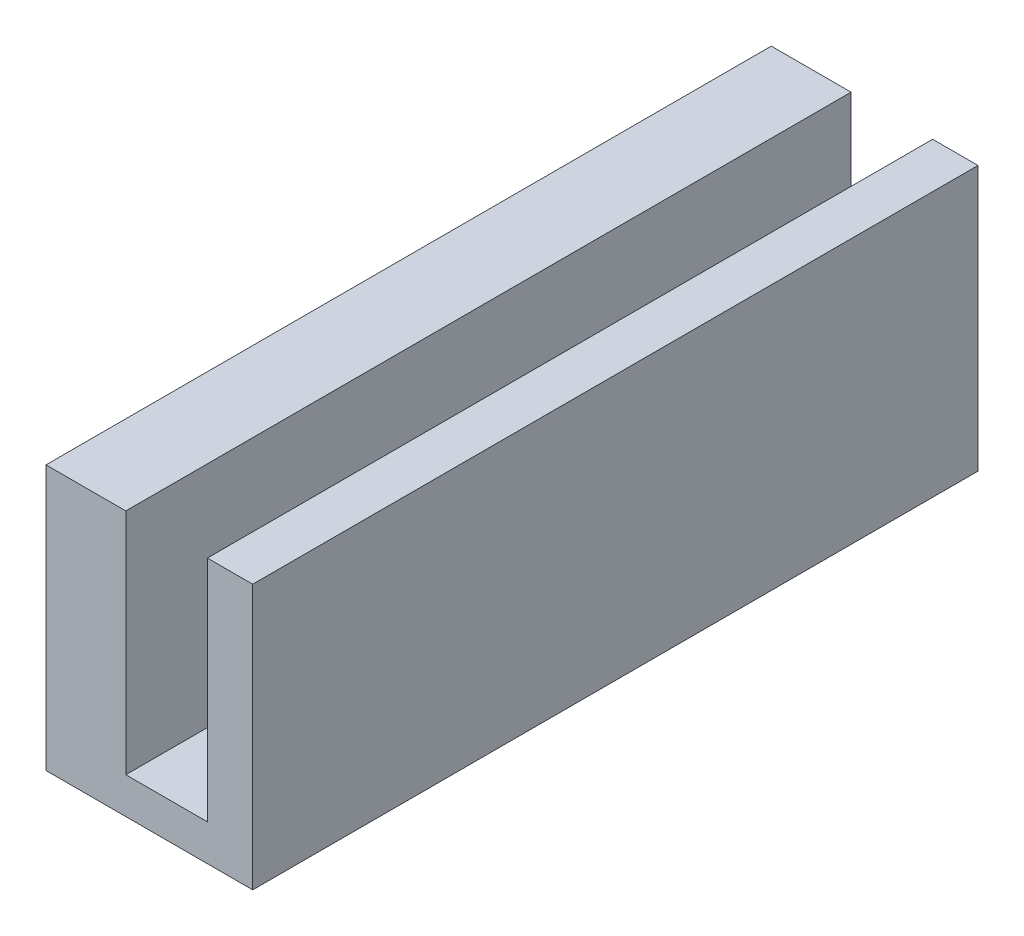
ISO-10303-21;
HEADER;
FILE_DESCRIPTION(('STEP AP214'),'2;1');
FILE_NAME('part.step','',(''),(''),'','','');
FILE_SCHEMA(('AUTOMOTIVE_DESIGN { 1 0 10303 214 1 1 1 1 }'));
ENDSEC;
DATA;
#1=APPLICATION_CONTEXT('core data for automotive mechanical design processes');
#2=APPLICATION_PROTOCOL_DEFINITION('international standard','automotive_design',2000,#1);
#3=PRODUCT_CONTEXT('',#1,'mechanical');
#4=PRODUCT('Part','Part','',(#3));
#5=PRODUCT_RELATED_PRODUCT_CATEGORY('part','',(#4));
#6=PRODUCT_DEFINITION_FORMATION('','',#4);
#7=PRODUCT_DEFINITION_CONTEXT('part definition',#1,'design');
#8=PRODUCT_DEFINITION('design','',#6,#7);
#9=PRODUCT_DEFINITION_SHAPE('','',#8);
#10=(LENGTH_UNIT() NAMED_UNIT(*) SI_UNIT(.MILLI.,.METRE.));
#11=(NAMED_UNIT(*) PLANE_ANGLE_UNIT() SI_UNIT($,.RADIAN.));
#12=(NAMED_UNIT(*) SI_UNIT($,.STERADIAN.) SOLID_ANGLE_UNIT());
#13=UNCERTAINTY_MEASURE_WITH_UNIT(LENGTH_MEASURE(1.E-05),#10,'distance_accuracy_value','');
#14=(GEOMETRIC_REPRESENTATION_CONTEXT(3) GLOBAL_UNCERTAINTY_ASSIGNED_CONTEXT((#13)) GLOBAL_UNIT_ASSIGNED_CONTEXT((#10,
#11,#12)) REPRESENTATION_CONTEXT('',''));
#15=CARTESIAN_POINT('',(0.,0.,0.));
#16=DIRECTION('',(0.,0.,1.));
#17=DIRECTION('',(1.,0.,0.));
#18=AXIS2_PLACEMENT_3D('',#15,#16,#17);
#19=CARTESIAN_POINT('',(0.,1.,0.));
#20=DIRECTION('',(0.,-1.,0.));
#21=DIRECTION('',(0.,0.,-1.));
#22=AXIS2_PLACEMENT_3D('',#19,#20,#21);
#23=PLANE('',#22);
#24=DIRECTION('',(0.,0.,1.));
#25=VECTOR('',#24,1.);
#26=CARTESIAN_POINT('',(4.45,1.,-20.));
#27=LINE('',#26,#25);
#28=CARTESIAN_POINT('',(4.45,1.,-20.));
#29=VERTEX_POINT('',#28);
#30=CARTESIAN_POINT('',(4.45,1.,0.));
#31=VERTEX_POINT('',#30);
#32=EDGE_CURVE('E125',#29,#31,#27,.T.);
#33=ORIENTED_EDGE('',*,*,#32,.F.);
#34=DIRECTION('',(-1.,0.,0.));
#35=VECTOR('',#34,1.);
#36=CARTESIAN_POINT('',(0.,1.,-20.));
#37=LINE('',#36,#35);
#38=CARTESIAN_POINT('',(2.2,1.,-20.));
#39=VERTEX_POINT('',#38);
#40=EDGE_CURVE('E37',#29,#39,#37,.T.);
#41=ORIENTED_EDGE('',*,*,#40,.T.);
#42=DIRECTION('',(0.,0.,-1.));
#43=VECTOR('',#42,1.);
#44=CARTESIAN_POINT('',(2.2,1.,-20.));
#45=LINE('',#44,#43);
#46=CARTESIAN_POINT('',(2.2,1.,0.));
#47=VERTEX_POINT('',#46);
#48=EDGE_CURVE('E56',#47,#39,#45,.T.);
#49=ORIENTED_EDGE('',*,*,#48,.F.);
#50=DIRECTION('',(1.,0.,0.));
#51=VECTOR('',#50,1.);
#52=CARTESIAN_POINT('',(0.,1.,0.));
#53=LINE('',#52,#51);
#54=EDGE_CURVE('E51',#47,#31,#53,.T.);
#55=ORIENTED_EDGE('',*,*,#54,.T.);
#56=EDGE_LOOP('',(#33,#41,#49,#55));
#57=FACE_BOUND('',#56,.T.);
#58=ADVANCED_FACE('F33',(#57),#23,.F.);
#59=CARTESIAN_POINT('',(0.,1.,0.));
#60=DIRECTION('',(1.,0.,0.));
#61=DIRECTION('',(0.,0.,-1.));
#62=AXIS2_PLACEMENT_3D('',#59,#60,#61);
#63=PLANE('',#62);
#64=DIRECTION('',(0.,0.,1.));
#65=VECTOR('',#64,1.);
#66=CARTESIAN_POINT('',(0.,0.,0.));
#67=LINE('',#66,#65);
#68=CARTESIAN_POINT('',(0.,0.,-20.));
#69=VERTEX_POINT('',#68);
#70=CARTESIAN_POINT('',(0.,0.,0.));
#71=VERTEX_POINT('',#70);
#72=EDGE_CURVE('E158',#69,#71,#67,.T.);
#73=ORIENTED_EDGE('',*,*,#72,.T.);
#74=DIRECTION('',(0.,-1.,0.));
#75=VECTOR('',#74,1.);
#76=CARTESIAN_POINT('',(0.,1.,0.));
#77=LINE('',#76,#75);
#78=CARTESIAN_POINT('',(0.,7.3,0.));
#79=VERTEX_POINT('',#78);
#80=EDGE_CURVE('E11',#79,#71,#77,.T.);
#81=ORIENTED_EDGE('',*,*,#80,.F.);
#82=DIRECTION('',(0.,0.,1.));
#83=VECTOR('',#82,1.);
#84=CARTESIAN_POINT('',(0.,7.3,-20.));
#85=LINE('',#84,#83);
#86=CARTESIAN_POINT('',(0.,7.3,-20.));
#87=VERTEX_POINT('',#86);
#88=EDGE_CURVE('E135',#87,#79,#85,.T.);
#89=ORIENTED_EDGE('',*,*,#88,.F.);
#90=DIRECTION('',(0.,-1.,0.));
#91=VECTOR('',#90,1.);
#92=CARTESIAN_POINT('',(0.,1.,-20.));
#93=LINE('',#92,#91);
#94=EDGE_CURVE('E110',#87,#69,#93,.T.);
#95=ORIENTED_EDGE('',*,*,#94,.T.);
#96=EDGE_LOOP('',(#73,#81,#89,#95));
#97=FACE_BOUND('',#96,.T.);
#98=ADVANCED_FACE('F35',(#97),#63,.F.);
#99=CARTESIAN_POINT('',(0.,1.,0.));
#100=DIRECTION('',(0.,0.,-1.));
#101=DIRECTION('',(-1.,0.,0.));
#102=AXIS2_PLACEMENT_3D('',#99,#100,#101);
#103=PLANE('',#102);
#104=DIRECTION('',(1.,0.,0.));
#105=VECTOR('',#104,1.);
#106=CARTESIAN_POINT('',(0.,0.,0.));
#107=LINE('',#106,#105);
#108=CARTESIAN_POINT('',(5.7,0.,0.));
#109=VERTEX_POINT('',#108);
#110=EDGE_CURVE('E164',#71,#109,#107,.T.);
#111=ORIENTED_EDGE('',*,*,#110,.T.);
#112=DIRECTION('',(0.,-1.,0.));
#113=VECTOR('',#112,1.);
#114=CARTESIAN_POINT('',(5.7,1.,0.));
#115=LINE('',#114,#113);
#116=CARTESIAN_POINT('',(5.7,7.3,0.));
#117=VERTEX_POINT('',#116);
#118=EDGE_CURVE('E43',#117,#109,#115,.T.);
#119=ORIENTED_EDGE('',*,*,#118,.F.);
#120=DIRECTION('',(1.,0.,0.));
#121=VECTOR('',#120,1.);
#122=CARTESIAN_POINT('',(5.7,7.3,0.));
#123=LINE('',#122,#121);
#124=CARTESIAN_POINT('',(4.45,7.3,0.));
#125=VERTEX_POINT('',#124);
#126=EDGE_CURVE('E124',#125,#117,#123,.T.);
#127=ORIENTED_EDGE('',*,*,#126,.F.);
#128=DIRECTION('',(0.,-1.,0.));
#129=VECTOR('',#128,1.);
#130=CARTESIAN_POINT('',(4.45,7.3,0.));
#131=LINE('',#130,#129);
#132=EDGE_CURVE('E130',#125,#31,#131,.T.);
#133=ORIENTED_EDGE('',*,*,#132,.T.);
#134=ORIENTED_EDGE('',*,*,#54,.F.);
#135=DIRECTION('',(0.,-1.,0.));
#136=VECTOR('',#135,1.);
#137=CARTESIAN_POINT('',(2.2,7.3,0.));
#138=LINE('',#137,#136);
#139=CARTESIAN_POINT('',(2.2,7.3,0.));
#140=VERTEX_POINT('',#139);
#141=EDGE_CURVE('E154',#140,#47,#138,.T.);
#142=ORIENTED_EDGE('',*,*,#141,.F.);
#143=DIRECTION('',(1.,0.,0.));
#144=VECTOR('',#143,1.);
#145=CARTESIAN_POINT('',(0.,7.3,0.));
#146=LINE('',#145,#144);
#147=EDGE_CURVE('E138',#79,#140,#146,.T.);
#148=ORIENTED_EDGE('',*,*,#147,.F.);
#149=ORIENTED_EDGE('',*,*,#80,.T.);
#150=EDGE_LOOP('',(#111,#119,#127,#133,#134,#142,#148,#149));
#151=FACE_BOUND('',#150,.T.);
#152=ADVANCED_FACE('F200',(#151),#103,.F.);
#153=CARTESIAN_POINT('',(5.7,1.,0.));
#154=DIRECTION('',(-1.,0.,0.));
#155=DIRECTION('',(0.,0.,1.));
#156=AXIS2_PLACEMENT_3D('',#153,#154,#155);
#157=PLANE('',#156);
#158=DIRECTION('',(0.,0.,-1.));
#159=VECTOR('',#158,1.);
#160=CARTESIAN_POINT('',(5.7,0.,0.));
#161=LINE('',#160,#159);
#162=CARTESIAN_POINT('',(5.7,0.,-20.));
#163=VERTEX_POINT('',#162);
#164=EDGE_CURVE('E107',#109,#163,#161,.T.);
#165=ORIENTED_EDGE('',*,*,#164,.T.);
#166=DIRECTION('',(0.,-1.,0.));
#167=VECTOR('',#166,1.);
#168=CARTESIAN_POINT('',(5.7,1.,-20.));
#169=LINE('',#168,#167);
#170=CARTESIAN_POINT('',(5.7,7.3,-20.));
#171=VERTEX_POINT('',#170);
#172=EDGE_CURVE('E100',#171,#163,#169,.T.);
#173=ORIENTED_EDGE('',*,*,#172,.F.);
#174=DIRECTION('',(0.,0.,-1.));
#175=VECTOR('',#174,1.);
#176=CARTESIAN_POINT('',(5.7,7.3,-20.));
#177=LINE('',#176,#175);
#178=EDGE_CURVE('E105',#117,#171,#177,.T.);
#179=ORIENTED_EDGE('',*,*,#178,.F.);
#180=ORIENTED_EDGE('',*,*,#118,.T.);
#181=EDGE_LOOP('',(#165,#173,#179,#180));
#182=FACE_BOUND('',#181,.T.);
#183=ADVANCED_FACE('F102',(#182),#157,.F.);
#184=CARTESIAN_POINT('',(0.,1.,-20.));
#185=DIRECTION('',(0.,0.,1.));
#186=DIRECTION('',(1.,0.,0.));
#187=AXIS2_PLACEMENT_3D('',#184,#185,#186);
#188=PLANE('',#187);
#189=DIRECTION('',(-1.,0.,0.));
#190=VECTOR('',#189,1.);
#191=CARTESIAN_POINT('',(0.,0.,-20.));
#192=LINE('',#191,#190);
#193=EDGE_CURVE('E173',#163,#69,#192,.T.);
#194=ORIENTED_EDGE('',*,*,#193,.T.);
#195=ORIENTED_EDGE('',*,*,#94,.F.);
#196=DIRECTION('',(-1.,0.,0.));
#197=VECTOR('',#196,1.);
#198=CARTESIAN_POINT('',(0.,7.3,-20.));
#199=LINE('',#198,#197);
#200=CARTESIAN_POINT('',(2.2,7.3,-20.));
#201=VERTEX_POINT('',#200);
#202=EDGE_CURVE('E142',#201,#87,#199,.T.);
#203=ORIENTED_EDGE('',*,*,#202,.F.);
#204=DIRECTION('',(0.,-1.,0.));
#205=VECTOR('',#204,1.);
#206=CARTESIAN_POINT('',(2.2,7.3,-20.));
#207=LINE('',#206,#205);
#208=EDGE_CURVE('E145',#201,#39,#207,.T.);
#209=ORIENTED_EDGE('',*,*,#208,.T.);
#210=ORIENTED_EDGE('',*,*,#40,.F.);
#211=DIRECTION('',(0.,-1.,0.));
#212=VECTOR('',#211,1.);
#213=CARTESIAN_POINT('',(4.45,7.3,-20.));
#214=LINE('',#213,#212);
#215=CARTESIAN_POINT('',(4.45,7.3,-20.));
#216=VERTEX_POINT('',#215);
#217=EDGE_CURVE('E116',#216,#29,#214,.T.);
#218=ORIENTED_EDGE('',*,*,#217,.F.);
#219=DIRECTION('',(-1.,0.,0.));
#220=VECTOR('',#219,1.);
#221=CARTESIAN_POINT('',(5.7,7.3,-20.));
#222=LINE('',#221,#220);
#223=EDGE_CURVE('E113',#171,#216,#222,.T.);
#224=ORIENTED_EDGE('',*,*,#223,.F.);
#225=ORIENTED_EDGE('',*,*,#172,.T.);
#226=EDGE_LOOP('',(#194,#195,#203,#209,#210,#218,#224,#225));
#227=FACE_BOUND('',#226,.T.);
#228=ADVANCED_FACE('F114',(#227),#188,.F.);
#229=CARTESIAN_POINT('',(0.,0.,0.));
#230=DIRECTION('',(0.,-1.,0.));
#231=DIRECTION('',(0.,0.,-1.));
#232=AXIS2_PLACEMENT_3D('',#229,#230,#231);
#233=PLANE('',#232);
#234=ORIENTED_EDGE('',*,*,#72,.F.);
#235=ORIENTED_EDGE('',*,*,#193,.F.);
#236=ORIENTED_EDGE('',*,*,#164,.F.);
#237=ORIENTED_EDGE('',*,*,#110,.F.);
#238=EDGE_LOOP('',(#234,#235,#236,#237));
#239=FACE_BOUND('',#238,.T.);
#240=ADVANCED_FACE('F178',(#239),#233,.T.);
#241=CARTESIAN_POINT('',(2.2,7.3,-20.));
#242=DIRECTION('',(-1.,0.,0.));
#243=DIRECTION('',(0.,0.,1.));
#244=AXIS2_PLACEMENT_3D('',#241,#242,#243);
#245=PLANE('',#244);
#246=ORIENTED_EDGE('',*,*,#48,.T.);
#247=ORIENTED_EDGE('',*,*,#208,.F.);
#248=DIRECTION('',(0.,0.,-1.));
#249=VECTOR('',#248,1.);
#250=CARTESIAN_POINT('',(2.2,7.3,-20.));
#251=LINE('',#250,#249);
#252=EDGE_CURVE('E140',#140,#201,#251,.T.);
#253=ORIENTED_EDGE('',*,*,#252,.F.);
#254=ORIENTED_EDGE('',*,*,#141,.T.);
#255=EDGE_LOOP('',(#246,#247,#253,#254));
#256=FACE_BOUND('',#255,.T.);
#257=ADVANCED_FACE('F185',(#256),#245,.F.);
#258=CARTESIAN_POINT('',(0.,7.3,0.));
#259=DIRECTION('',(0.,1.,0.));
#260=DIRECTION('',(0.,0.,1.));
#261=AXIS2_PLACEMENT_3D('',#258,#259,#260);
#262=PLANE('',#261);
#263=ORIENTED_EDGE('',*,*,#88,.T.);
#264=ORIENTED_EDGE('',*,*,#147,.T.);
#265=ORIENTED_EDGE('',*,*,#252,.T.);
#266=ORIENTED_EDGE('',*,*,#202,.T.);
#267=EDGE_LOOP('',(#263,#264,#265,#266));
#268=FACE_BOUND('',#267,.T.);
#269=ADVANCED_FACE('F183',(#268),#262,.T.);
#270=CARTESIAN_POINT('',(4.45,7.3,-20.));
#271=DIRECTION('',(1.,0.,0.));
#272=DIRECTION('',(0.,0.,-1.));
#273=AXIS2_PLACEMENT_3D('',#270,#271,#272);
#274=PLANE('',#273);
#275=ORIENTED_EDGE('',*,*,#32,.T.);
#276=ORIENTED_EDGE('',*,*,#132,.F.);
#277=DIRECTION('',(0.,0.,1.));
#278=VECTOR('',#277,1.);
#279=CARTESIAN_POINT('',(4.45,7.3,-20.));
#280=LINE('',#279,#278);
#281=EDGE_CURVE('E119',#216,#125,#280,.T.);
#282=ORIENTED_EDGE('',*,*,#281,.F.);
#283=ORIENTED_EDGE('',*,*,#217,.T.);
#284=EDGE_LOOP('',(#275,#276,#282,#283));
#285=FACE_BOUND('',#284,.T.);
#286=ADVANCED_FACE('F192',(#285),#274,.F.);
#287=CARTESIAN_POINT('',(0.,7.3,0.));
#288=DIRECTION('',(0.,-1.,0.));
#289=DIRECTION('',(0.,0.,-1.));
#290=AXIS2_PLACEMENT_3D('',#287,#288,#289);
#291=PLANE('',#290);
#292=ORIENTED_EDGE('',*,*,#178,.T.);
#293=ORIENTED_EDGE('',*,*,#223,.T.);
#294=ORIENTED_EDGE('',*,*,#281,.T.);
#295=ORIENTED_EDGE('',*,*,#126,.T.);
#296=EDGE_LOOP('',(#292,#293,#294,#295));
#297=FACE_BOUND('',#296,.T.);
#298=ADVANCED_FACE('F122',(#297),#291,.F.);
#299=CLOSED_SHELL('',(#58,#98,#152,#183,#228,#240,#257,#269,#286,#298));
#300=MANIFOLD_SOLID_BREP('B2',#299);
#301=ADVANCED_BREP_SHAPE_REPRESENTATION('',(#18,#300),#14);
#302=SHAPE_DEFINITION_REPRESENTATION(#9,#301);
ENDSEC;
END-ISO-10303-21;
